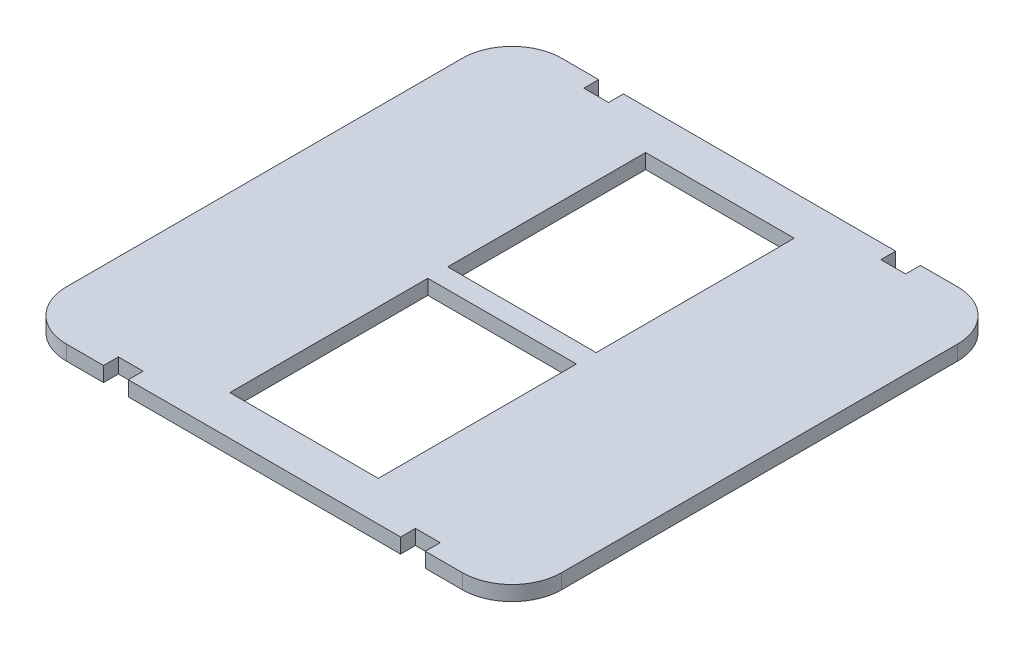
ISO-10303-21;
HEADER;
FILE_DESCRIPTION(('STEP AP214'),'2;1');
FILE_NAME('part.step','',(''),(''),'','','');
FILE_SCHEMA(('AUTOMOTIVE_DESIGN { 1 0 10303 214 1 1 1 1 }'));
ENDSEC;
DATA;
#1=APPLICATION_CONTEXT('core data for automotive mechanical design processes');
#2=APPLICATION_PROTOCOL_DEFINITION('international standard','automotive_design',2000,#1);
#3=PRODUCT_CONTEXT('',#1,'mechanical');
#4=PRODUCT('Part','Part','',(#3));
#5=PRODUCT_RELATED_PRODUCT_CATEGORY('part','',(#4));
#6=PRODUCT_DEFINITION_FORMATION('','',#4);
#7=PRODUCT_DEFINITION_CONTEXT('part definition',#1,'design');
#8=PRODUCT_DEFINITION('design','',#6,#7);
#9=PRODUCT_DEFINITION_SHAPE('','',#8);
#10=(LENGTH_UNIT() NAMED_UNIT(*) SI_UNIT(.MILLI.,.METRE.));
#11=(NAMED_UNIT(*) PLANE_ANGLE_UNIT() SI_UNIT($,.RADIAN.));
#12=(NAMED_UNIT(*) SI_UNIT($,.STERADIAN.) SOLID_ANGLE_UNIT());
#13=UNCERTAINTY_MEASURE_WITH_UNIT(LENGTH_MEASURE(1.E-05),#10,'distance_accuracy_value','');
#14=(GEOMETRIC_REPRESENTATION_CONTEXT(3) GLOBAL_UNCERTAINTY_ASSIGNED_CONTEXT((#13)) GLOBAL_UNIT_ASSIGNED_CONTEXT((#10,
#11,#12)) REPRESENTATION_CONTEXT('',''));
#15=CARTESIAN_POINT('',(0.,0.,0.));
#16=DIRECTION('',(0.,0.,1.));
#17=DIRECTION('',(1.,0.,0.));
#18=AXIS2_PLACEMENT_3D('',#15,#16,#17);
#19=CARTESIAN_POINT('',(0.,7.62,0.));
#20=DIRECTION('',(0.,-1.,0.));
#21=DIRECTION('',(0.,0.,-1.));
#22=AXIS2_PLACEMENT_3D('',#19,#20,#21);
#23=PLANE('',#22);
#24=DIRECTION('',(0.,0.,1.));
#25=VECTOR('',#24,1.);
#26=CARTESIAN_POINT('',(38.1,7.62,-5.07999999999999));
#27=LINE('',#26,#25);
#28=CARTESIAN_POINT('',(38.1,7.62,-106.68));
#29=VERTEX_POINT('',#28);
#30=CARTESIAN_POINT('',(38.1,7.62,-5.07999999999999));
#31=VERTEX_POINT('',#30);
#32=EDGE_CURVE('E471',#29,#31,#27,.T.);
#33=ORIENTED_EDGE('',*,*,#32,.T.);
#34=DIRECTION('',(-1.,0.,0.));
#35=VECTOR('',#34,1.);
#36=CARTESIAN_POINT('',(-38.1,7.62,-5.07999999999999));
#37=LINE('',#36,#35);
#38=CARTESIAN_POINT('',(-38.1,7.62,-5.07999999999999));
#39=VERTEX_POINT('',#38);
#40=EDGE_CURVE('E481',#31,#39,#37,.T.);
#41=ORIENTED_EDGE('',*,*,#40,.T.);
#42=DIRECTION('',(0.,0.,-1.));
#43=VECTOR('',#42,1.);
#44=CARTESIAN_POINT('',(-38.1,7.62,-5.07999999999999));
#45=LINE('',#44,#43);
#46=CARTESIAN_POINT('',(-38.1,7.62,-106.68));
#47=VERTEX_POINT('',#46);
#48=EDGE_CURVE('E494',#39,#47,#45,.T.);
#49=ORIENTED_EDGE('',*,*,#48,.T.);
#50=DIRECTION('',(1.,0.,0.));
#51=VECTOR('',#50,1.);
#52=CARTESIAN_POINT('',(-38.1,7.62,-106.68));
#53=LINE('',#52,#51);
#54=EDGE_CURVE('E491',#47,#29,#53,.T.);
#55=ORIENTED_EDGE('',*,*,#54,.T.);
#56=EDGE_LOOP('',(#33,#41,#49,#55));
#57=FACE_BOUND('',#56,.T.);
#58=DIRECTION('',(-1.,0.,0.));
#59=VECTOR('',#58,1.);
#60=CARTESIAN_POINT('',(-38.1,7.62,5.07999999999999));
#61=LINE('',#60,#59);
#62=CARTESIAN_POINT('',(38.1,7.62,5.07999999999999));
#63=VERTEX_POINT('',#62);
#64=CARTESIAN_POINT('',(-38.1,7.62,5.07999999999999));
#65=VERTEX_POINT('',#64);
#66=EDGE_CURVE('E367',#63,#65,#61,.T.);
#67=ORIENTED_EDGE('',*,*,#66,.F.);
#68=DIRECTION('',(0.,0.,-1.));
#69=VECTOR('',#68,1.);
#70=CARTESIAN_POINT('',(38.1,7.62,5.07999999999999));
#71=LINE('',#70,#69);
#72=CARTESIAN_POINT('',(38.1,7.62,106.68));
#73=VERTEX_POINT('',#72);
#74=EDGE_CURVE('E348',#73,#63,#71,.T.);
#75=ORIENTED_EDGE('',*,*,#74,.F.);
#76=DIRECTION('',(1.,0.,0.));
#77=VECTOR('',#76,1.);
#78=CARTESIAN_POINT('',(-38.1,7.62,106.68));
#79=LINE('',#78,#77);
#80=CARTESIAN_POINT('',(-38.1,7.62,106.68));
#81=VERTEX_POINT('',#80);
#82=EDGE_CURVE('E356',#81,#73,#79,.T.);
#83=ORIENTED_EDGE('',*,*,#82,.F.);
#84=DIRECTION('',(0.,0.,1.));
#85=VECTOR('',#84,1.);
#86=CARTESIAN_POINT('',(-38.1,7.62,5.07999999999999));
#87=LINE('',#86,#85);
#88=EDGE_CURVE('E370',#65,#81,#87,.T.);
#89=ORIENTED_EDGE('',*,*,#88,.F.);
#90=EDGE_LOOP('',(#67,#75,#83,#89));
#91=FACE_BOUND('',#90,.T.);
#92=DIRECTION('',(0.,0.,-1.));
#93=VECTOR('',#92,1.);
#94=CARTESIAN_POINT('',(69.8500000000001,7.62,119.38));
#95=LINE('',#94,#93);
#96=CARTESIAN_POINT('',(69.8500000000001,7.62,127.));
#97=VERTEX_POINT('',#96);
#98=CARTESIAN_POINT('',(69.8500000000001,7.62,119.38));
#99=VERTEX_POINT('',#98);
#100=EDGE_CURVE('E249',#97,#99,#95,.T.);
#101=ORIENTED_EDGE('',*,*,#100,.T.);
#102=DIRECTION('',(1.,0.,0.));
#103=VECTOR('',#102,1.);
#104=CARTESIAN_POINT('',(82.5500000000001,7.62,119.38));
#105=LINE('',#104,#103);
#106=CARTESIAN_POINT('',(82.5500000000001,7.62,119.38));
#107=VERTEX_POINT('',#106);
#108=EDGE_CURVE('E263',#99,#107,#105,.T.);
#109=ORIENTED_EDGE('',*,*,#108,.T.);
#110=DIRECTION('',(0.,0.,1.));
#111=VECTOR('',#110,1.);
#112=CARTESIAN_POINT('',(82.5500000000001,7.62,119.38));
#113=LINE('',#112,#111);
#114=CARTESIAN_POINT('',(82.5500000000001,7.62,127.));
#115=VERTEX_POINT('',#114);
#116=EDGE_CURVE('E436',#107,#115,#113,.T.);
#117=ORIENTED_EDGE('',*,*,#116,.T.);
#118=DIRECTION('',(1.,0.,0.));
#119=VECTOR('',#118,1.);
#120=CARTESIAN_POINT('',(-127.,7.62,127.));
#121=LINE('',#120,#119);
#122=CARTESIAN_POINT('',(101.6,7.62,127.));
#123=VERTEX_POINT('',#122);
#124=EDGE_CURVE('E394',#115,#123,#121,.T.);
#125=ORIENTED_EDGE('',*,*,#124,.T.);
#126=CARTESIAN_POINT('',(101.6,7.62,101.6));
#127=DIRECTION('',(0.,-1.,0.));
#128=DIRECTION('',(0.,0.,-1.));
#129=AXIS2_PLACEMENT_3D('',#126,#127,#128);
#130=CIRCLE('',#129,25.4);
#131=CARTESIAN_POINT('',(127.,7.62,101.6));
#132=VERTEX_POINT('',#131);
#133=EDGE_CURVE('E301',#123,#132,#130,.F.);
#134=ORIENTED_EDGE('',*,*,#133,.T.);
#135=DIRECTION('',(0.,0.,-1.));
#136=VECTOR('',#135,1.);
#137=CARTESIAN_POINT('',(127.,7.62,127.));
#138=LINE('',#137,#136);
#139=CARTESIAN_POINT('',(127.,7.62,-101.6));
#140=VERTEX_POINT('',#139);
#141=EDGE_CURVE('E272',#132,#140,#138,.T.);
#142=ORIENTED_EDGE('',*,*,#141,.T.);
#143=CARTESIAN_POINT('',(101.6,7.62,-101.6));
#144=DIRECTION('',(0.,-1.,0.));
#145=DIRECTION('',(0.,0.,-1.));
#146=AXIS2_PLACEMENT_3D('',#143,#144,#145);
#147=CIRCLE('',#146,25.4);
#148=CARTESIAN_POINT('',(101.6,7.62,-127.));
#149=VERTEX_POINT('',#148);
#150=EDGE_CURVE('E303',#140,#149,#147,.F.);
#151=ORIENTED_EDGE('',*,*,#150,.T.);
#152=DIRECTION('',(-1.,0.,0.));
#153=VECTOR('',#152,1.);
#154=CARTESIAN_POINT('',(-127.,7.62,-127.));
#155=LINE('',#154,#153);
#156=CARTESIAN_POINT('',(82.5499999999999,7.62,-127.));
#157=VERTEX_POINT('',#156);
#158=EDGE_CURVE('E387',#149,#157,#155,.T.);
#159=ORIENTED_EDGE('',*,*,#158,.T.);
#160=DIRECTION('',(0.,0.,-1.));
#161=VECTOR('',#160,1.);
#162=CARTESIAN_POINT('',(82.5499999999999,7.62,-119.38));
#163=LINE('',#162,#161);
#164=CARTESIAN_POINT('',(82.5499999999999,7.62,-119.38));
#165=VERTEX_POINT('',#164);
#166=EDGE_CURVE('E56',#165,#157,#163,.T.);
#167=ORIENTED_EDGE('',*,*,#166,.F.);
#168=DIRECTION('',(1.,0.,0.));
#169=VECTOR('',#168,1.);
#170=CARTESIAN_POINT('',(82.5499999999999,7.62,-119.38));
#171=LINE('',#170,#169);
#172=CARTESIAN_POINT('',(69.8499999999999,7.62,-119.38));
#173=VERTEX_POINT('',#172);
#174=EDGE_CURVE('E459',#173,#165,#171,.T.);
#175=ORIENTED_EDGE('',*,*,#174,.F.);
#176=DIRECTION('',(0.,0.,1.));
#177=VECTOR('',#176,1.);
#178=CARTESIAN_POINT('',(69.8499999999999,7.62,-119.38));
#179=LINE('',#178,#177);
#180=CARTESIAN_POINT('',(69.8499999999999,7.62,-127.));
#181=VERTEX_POINT('',#180);
#182=EDGE_CURVE('E465',#181,#173,#179,.T.);
#183=ORIENTED_EDGE('',*,*,#182,.F.);
#184=CARTESIAN_POINT('',(-69.85,7.62,-127.));
#185=VERTEX_POINT('',#184);
#186=EDGE_CURVE('E391',#181,#185,#155,.T.);
#187=ORIENTED_EDGE('',*,*,#186,.T.);
#188=DIRECTION('',(0.,0.,1.));
#189=VECTOR('',#188,1.);
#190=CARTESIAN_POINT('',(-69.85,7.62,-119.38));
#191=LINE('',#190,#189);
#192=CARTESIAN_POINT('',(-69.85,7.62,-119.38));
#193=VERTEX_POINT('',#192);
#194=EDGE_CURVE('E502',#185,#193,#191,.T.);
#195=ORIENTED_EDGE('',*,*,#194,.T.);
#196=DIRECTION('',(-1.,0.,0.));
#197=VECTOR('',#196,1.);
#198=CARTESIAN_POINT('',(-82.55,7.62,-119.38));
#199=LINE('',#198,#197);
#200=CARTESIAN_POINT('',(-82.55,7.62,-119.38));
#201=VERTEX_POINT('',#200);
#202=EDGE_CURVE('E512',#193,#201,#199,.T.);
#203=ORIENTED_EDGE('',*,*,#202,.T.);
#204=DIRECTION('',(0.,0.,-1.));
#205=VECTOR('',#204,1.);
#206=CARTESIAN_POINT('',(-82.55,7.62,-119.38));
#207=LINE('',#206,#205);
#208=CARTESIAN_POINT('',(-82.55,7.62,-127.));
#209=VERTEX_POINT('',#208);
#210=EDGE_CURVE('E520',#201,#209,#207,.T.);
#211=ORIENTED_EDGE('',*,*,#210,.T.);
#212=CARTESIAN_POINT('',(-101.6,7.62,-127.));
#213=VERTEX_POINT('',#212);
#214=EDGE_CURVE('E386',#209,#213,#155,.T.);
#215=ORIENTED_EDGE('',*,*,#214,.T.);
#216=CARTESIAN_POINT('',(-101.6,7.62,-101.6));
#217=DIRECTION('',(0.,-1.,0.));
#218=DIRECTION('',(0.,0.,-1.));
#219=AXIS2_PLACEMENT_3D('',#216,#217,#218);
#220=CIRCLE('',#219,25.4);
#221=CARTESIAN_POINT('',(-127.,7.62,-101.6));
#222=VERTEX_POINT('',#221);
#223=EDGE_CURVE('E305',#213,#222,#220,.F.);
#224=ORIENTED_EDGE('',*,*,#223,.T.);
#225=DIRECTION('',(0.,0.,1.));
#226=VECTOR('',#225,1.);
#227=CARTESIAN_POINT('',(-127.,7.62,127.));
#228=LINE('',#227,#226);
#229=CARTESIAN_POINT('',(-127.,7.62,101.6));
#230=VERTEX_POINT('',#229);
#231=EDGE_CURVE('E390',#222,#230,#228,.T.);
#232=ORIENTED_EDGE('',*,*,#231,.T.);
#233=CARTESIAN_POINT('',(-101.6,7.62,101.6));
#234=DIRECTION('',(0.,-1.,0.));
#235=DIRECTION('',(0.,0.,-1.));
#236=AXIS2_PLACEMENT_3D('',#233,#234,#235);
#237=CIRCLE('',#236,25.4);
#238=CARTESIAN_POINT('',(-101.6,7.62,127.));
#239=VERTEX_POINT('',#238);
#240=EDGE_CURVE('E299',#230,#239,#237,.F.);
#241=ORIENTED_EDGE('',*,*,#240,.T.);
#242=CARTESIAN_POINT('',(-82.55,7.62,127.));
#243=VERTEX_POINT('',#242);
#244=EDGE_CURVE('E280',#239,#243,#121,.T.);
#245=ORIENTED_EDGE('',*,*,#244,.T.);
#246=DIRECTION('',(0.,0.,1.));
#247=VECTOR('',#246,1.);
#248=CARTESIAN_POINT('',(-82.55,7.62,119.38));
#249=LINE('',#248,#247);
#250=CARTESIAN_POINT('',(-82.55,7.62,119.38));
#251=VERTEX_POINT('',#250);
#252=EDGE_CURVE('E345',#251,#243,#249,.T.);
#253=ORIENTED_EDGE('',*,*,#252,.F.);
#254=DIRECTION('',(-1.,0.,0.));
#255=VECTOR('',#254,1.);
#256=CARTESIAN_POINT('',(-82.55,7.62,119.38));
#257=LINE('',#256,#255);
#258=CARTESIAN_POINT('',(-69.85,7.62,119.38));
#259=VERTEX_POINT('',#258);
#260=EDGE_CURVE('E341',#259,#251,#257,.T.);
#261=ORIENTED_EDGE('',*,*,#260,.F.);
#262=DIRECTION('',(0.,0.,-1.));
#263=VECTOR('',#262,1.);
#264=CARTESIAN_POINT('',(-69.85,7.62,119.38));
#265=LINE('',#264,#263);
#266=CARTESIAN_POINT('',(-69.85,7.62,127.));
#267=VERTEX_POINT('',#266);
#268=EDGE_CURVE('E338',#267,#259,#265,.T.);
#269=ORIENTED_EDGE('',*,*,#268,.F.);
#270=EDGE_CURVE('E396',#267,#97,#121,.T.);
#271=ORIENTED_EDGE('',*,*,#270,.T.);
#272=EDGE_LOOP('',(#101,#109,#117,#125,#134,#142,#151,#159,#167,#175,#183,#187,#195,#203,#211,
#215,#224,#232,#241,#245,#253,#261,#269,#271));
#273=FACE_BOUND('',#272,.T.);
#274=ADVANCED_FACE('F33',(#57,#91,#273),#23,.F.);
#275=CARTESIAN_POINT('',(0.,0.,0.));
#276=DIRECTION('',(0.,-1.,0.));
#277=DIRECTION('',(0.,0.,-1.));
#278=AXIS2_PLACEMENT_3D('',#275,#276,#277);
#279=PLANE('',#278);
#280=DIRECTION('',(0.,0.,-1.));
#281=VECTOR('',#280,1.);
#282=CARTESIAN_POINT('',(38.1,0.,5.07999999999999));
#283=LINE('',#282,#281);
#284=CARTESIAN_POINT('',(38.1,0.,106.68));
#285=VERTEX_POINT('',#284);
#286=CARTESIAN_POINT('',(38.1,0.,5.07999999999999));
#287=VERTEX_POINT('',#286);
#288=EDGE_CURVE('E352',#285,#287,#283,.T.);
#289=ORIENTED_EDGE('',*,*,#288,.T.);
#290=DIRECTION('',(-1.,0.,0.));
#291=VECTOR('',#290,1.);
#292=CARTESIAN_POINT('',(-38.1,0.,5.07999999999999));
#293=LINE('',#292,#291);
#294=CARTESIAN_POINT('',(-38.1,0.,5.07999999999999));
#295=VERTEX_POINT('',#294);
#296=EDGE_CURVE('E355',#287,#295,#293,.T.);
#297=ORIENTED_EDGE('',*,*,#296,.T.);
#298=DIRECTION('',(0.,0.,1.));
#299=VECTOR('',#298,1.);
#300=CARTESIAN_POINT('',(-38.1,0.,5.07999999999999));
#301=LINE('',#300,#299);
#302=CARTESIAN_POINT('',(-38.1,0.,106.68));
#303=VERTEX_POINT('',#302);
#304=EDGE_CURVE('E359',#295,#303,#301,.T.);
#305=ORIENTED_EDGE('',*,*,#304,.T.);
#306=DIRECTION('',(1.,0.,0.));
#307=VECTOR('',#306,1.);
#308=CARTESIAN_POINT('',(-38.1,0.,106.68));
#309=LINE('',#308,#307);
#310=EDGE_CURVE('E362',#303,#285,#309,.T.);
#311=ORIENTED_EDGE('',*,*,#310,.T.);
#312=EDGE_LOOP('',(#289,#297,#305,#311));
#313=FACE_BOUND('',#312,.T.);
#314=DIRECTION('',(-1.,0.,0.));
#315=VECTOR('',#314,1.);
#316=CARTESIAN_POINT('',(-38.1,0.,-5.07999999999999));
#317=LINE('',#316,#315);
#318=CARTESIAN_POINT('',(38.1,0.,-5.07999999999999));
#319=VERTEX_POINT('',#318);
#320=CARTESIAN_POINT('',(-38.1,0.,-5.07999999999999));
#321=VERTEX_POINT('',#320);
#322=EDGE_CURVE('E486',#319,#321,#317,.T.);
#323=ORIENTED_EDGE('',*,*,#322,.F.);
#324=DIRECTION('',(0.,0.,1.));
#325=VECTOR('',#324,1.);
#326=CARTESIAN_POINT('',(38.1,0.,-5.07999999999999));
#327=LINE('',#326,#325);
#328=CARTESIAN_POINT('',(38.1,0.,-106.68));
#329=VERTEX_POINT('',#328);
#330=EDGE_CURVE('E478',#329,#319,#327,.T.);
#331=ORIENTED_EDGE('',*,*,#330,.F.);
#332=DIRECTION('',(1.,0.,0.));
#333=VECTOR('',#332,1.);
#334=CARTESIAN_POINT('',(-38.1,0.,-106.68));
#335=LINE('',#334,#333);
#336=CARTESIAN_POINT('',(-38.1,0.,-106.68));
#337=VERTEX_POINT('',#336);
#338=EDGE_CURVE('E480',#337,#329,#335,.T.);
#339=ORIENTED_EDGE('',*,*,#338,.F.);
#340=DIRECTION('',(0.,0.,-1.));
#341=VECTOR('',#340,1.);
#342=CARTESIAN_POINT('',(-38.1,0.,-5.07999999999999));
#343=LINE('',#342,#341);
#344=EDGE_CURVE('E483',#321,#337,#343,.T.);
#345=ORIENTED_EDGE('',*,*,#344,.F.);
#346=EDGE_LOOP('',(#323,#331,#339,#345));
#347=FACE_BOUND('',#346,.T.);
#348=DIRECTION('',(1.,0.,0.));
#349=VECTOR('',#348,1.);
#350=CARTESIAN_POINT('',(82.5500000000001,0.,119.38));
#351=LINE('',#350,#349);
#352=CARTESIAN_POINT('',(69.8500000000001,0.,119.38));
#353=VERTEX_POINT('',#352);
#354=CARTESIAN_POINT('',(82.5500000000001,0.,119.38));
#355=VERTEX_POINT('',#354);
#356=EDGE_CURVE('E255',#353,#355,#351,.T.);
#357=ORIENTED_EDGE('',*,*,#356,.F.);
#358=DIRECTION('',(0.,0.,-1.));
#359=VECTOR('',#358,1.);
#360=CARTESIAN_POINT('',(69.8500000000001,0.,119.38));
#361=LINE('',#360,#359);
#362=CARTESIAN_POINT('',(69.8500000000001,0.,127.));
#363=VERTEX_POINT('',#362);
#364=EDGE_CURVE('E246',#363,#353,#361,.T.);
#365=ORIENTED_EDGE('',*,*,#364,.F.);
#366=DIRECTION('',(1.,0.,0.));
#367=VECTOR('',#366,1.);
#368=CARTESIAN_POINT('',(-127.,0.,127.));
#369=LINE('',#368,#367);
#370=CARTESIAN_POINT('',(-69.85,0.,127.));
#371=VERTEX_POINT('',#370);
#372=EDGE_CURVE('E262',#371,#363,#369,.T.);
#373=ORIENTED_EDGE('',*,*,#372,.F.);
#374=DIRECTION('',(0.,0.,-1.));
#375=VECTOR('',#374,1.);
#376=CARTESIAN_POINT('',(-69.85,0.,119.38));
#377=LINE('',#376,#375);
#378=CARTESIAN_POINT('',(-69.85,0.,119.38));
#379=VERTEX_POINT('',#378);
#380=EDGE_CURVE('E334',#371,#379,#377,.T.);
#381=ORIENTED_EDGE('',*,*,#380,.T.);
#382=DIRECTION('',(-1.,0.,0.));
#383=VECTOR('',#382,1.);
#384=CARTESIAN_POINT('',(-82.55,0.,119.38));
#385=LINE('',#384,#383);
#386=CARTESIAN_POINT('',(-82.55,0.,119.38));
#387=VERTEX_POINT('',#386);
#388=EDGE_CURVE('E327',#379,#387,#385,.T.);
#389=ORIENTED_EDGE('',*,*,#388,.T.);
#390=DIRECTION('',(0.,0.,1.));
#391=VECTOR('',#390,1.);
#392=CARTESIAN_POINT('',(-82.55,0.,119.38));
#393=LINE('',#392,#391);
#394=CARTESIAN_POINT('',(-82.55,0.,127.));
#395=VERTEX_POINT('',#394);
#396=EDGE_CURVE('E325',#387,#395,#393,.T.);
#397=ORIENTED_EDGE('',*,*,#396,.T.);
#398=CARTESIAN_POINT('',(-101.6,0.,127.));
#399=VERTEX_POINT('',#398);
#400=EDGE_CURVE('E268',#399,#395,#369,.T.);
#401=ORIENTED_EDGE('',*,*,#400,.F.);
#402=CARTESIAN_POINT('',(-101.6,0.,101.6));
#403=DIRECTION('',(0.,-1.,0.));
#404=DIRECTION('',(0.,0.,-1.));
#405=AXIS2_PLACEMENT_3D('',#402,#403,#404);
#406=CIRCLE('',#405,25.4);
#407=CARTESIAN_POINT('',(-127.,0.,101.6));
#408=VERTEX_POINT('',#407);
#409=EDGE_CURVE('E283',#399,#408,#406,.T.);
#410=ORIENTED_EDGE('',*,*,#409,.T.);
#411=DIRECTION('',(0.,0.,1.));
#412=VECTOR('',#411,1.);
#413=CARTESIAN_POINT('',(-127.,0.,127.));
#414=LINE('',#413,#412);
#415=CARTESIAN_POINT('',(-127.,0.,-101.6));
#416=VERTEX_POINT('',#415);
#417=EDGE_CURVE('E273',#416,#408,#414,.T.);
#418=ORIENTED_EDGE('',*,*,#417,.F.);
#419=CARTESIAN_POINT('',(-101.6,0.,-101.6));
#420=DIRECTION('',(0.,-1.,0.));
#421=DIRECTION('',(0.,0.,-1.));
#422=AXIS2_PLACEMENT_3D('',#419,#420,#421);
#423=CIRCLE('',#422,25.4);
#424=CARTESIAN_POINT('',(-101.6,0.,-127.));
#425=VERTEX_POINT('',#424);
#426=EDGE_CURVE('E290',#416,#425,#423,.T.);
#427=ORIENTED_EDGE('',*,*,#426,.T.);
#428=DIRECTION('',(-1.,0.,0.));
#429=VECTOR('',#428,1.);
#430=CARTESIAN_POINT('',(-127.,0.,-127.));
#431=LINE('',#430,#429);
#432=CARTESIAN_POINT('',(-82.55,0.,-127.));
#433=VERTEX_POINT('',#432);
#434=EDGE_CURVE('E398',#433,#425,#431,.T.);
#435=ORIENTED_EDGE('',*,*,#434,.F.);
#436=DIRECTION('',(0.,0.,-1.));
#437=VECTOR('',#436,1.);
#438=CARTESIAN_POINT('',(-82.55,0.,-119.38));
#439=LINE('',#438,#437);
#440=CARTESIAN_POINT('',(-82.55,0.,-119.38));
#441=VERTEX_POINT('',#440);
#442=EDGE_CURVE('E511',#441,#433,#439,.T.);
#443=ORIENTED_EDGE('',*,*,#442,.F.);
#444=DIRECTION('',(-1.,0.,0.));
#445=VECTOR('',#444,1.);
#446=CARTESIAN_POINT('',(-82.55,0.,-119.38));
#447=LINE('',#446,#445);
#448=CARTESIAN_POINT('',(-69.85,0.,-119.38));
#449=VERTEX_POINT('',#448);
#450=EDGE_CURVE('E514',#449,#441,#447,.T.);
#451=ORIENTED_EDGE('',*,*,#450,.F.);
#452=DIRECTION('',(0.,0.,1.));
#453=VECTOR('',#452,1.);
#454=CARTESIAN_POINT('',(-69.85,0.,-119.38));
#455=LINE('',#454,#453);
#456=CARTESIAN_POINT('',(-69.85,0.,-127.));
#457=VERTEX_POINT('',#456);
#458=EDGE_CURVE('E509',#457,#449,#455,.T.);
#459=ORIENTED_EDGE('',*,*,#458,.F.);
#460=CARTESIAN_POINT('',(69.8499999999999,0.,-127.));
#461=VERTEX_POINT('',#460);
#462=EDGE_CURVE('E401',#461,#457,#431,.T.);
#463=ORIENTED_EDGE('',*,*,#462,.F.);
#464=DIRECTION('',(0.,0.,1.));
#465=VECTOR('',#464,1.);
#466=CARTESIAN_POINT('',(69.8499999999999,0.,-119.38));
#467=LINE('',#466,#465);
#468=CARTESIAN_POINT('',(69.8499999999999,0.,-119.38));
#469=VERTEX_POINT('',#468);
#470=EDGE_CURVE('E460',#461,#469,#467,.T.);
#471=ORIENTED_EDGE('',*,*,#470,.T.);
#472=DIRECTION('',(1.,0.,0.));
#473=VECTOR('',#472,1.);
#474=CARTESIAN_POINT('',(82.5499999999999,0.,-119.38));
#475=LINE('',#474,#473);
#476=CARTESIAN_POINT('',(82.5499999999999,0.,-119.38));
#477=VERTEX_POINT('',#476);
#478=EDGE_CURVE('E463',#469,#477,#475,.T.);
#479=ORIENTED_EDGE('',*,*,#478,.T.);
#480=DIRECTION('',(0.,0.,-1.));
#481=VECTOR('',#480,1.);
#482=CARTESIAN_POINT('',(82.5499999999999,0.,-119.38));
#483=LINE('',#482,#481);
#484=CARTESIAN_POINT('',(82.5499999999999,0.,-127.));
#485=VERTEX_POINT('',#484);
#486=EDGE_CURVE('E477',#477,#485,#483,.T.);
#487=ORIENTED_EDGE('',*,*,#486,.T.);
#488=CARTESIAN_POINT('',(101.6,0.,-127.));
#489=VERTEX_POINT('',#488);
#490=EDGE_CURVE('E399',#489,#485,#431,.T.);
#491=ORIENTED_EDGE('',*,*,#490,.F.);
#492=CARTESIAN_POINT('',(101.6,0.,-101.6));
#493=DIRECTION('',(0.,-1.,0.));
#494=DIRECTION('',(0.,0.,-1.));
#495=AXIS2_PLACEMENT_3D('',#492,#493,#494);
#496=CIRCLE('',#495,25.4);
#497=CARTESIAN_POINT('',(127.,0.,-101.6));
#498=VERTEX_POINT('',#497);
#499=EDGE_CURVE('E288',#489,#498,#496,.T.);
#500=ORIENTED_EDGE('',*,*,#499,.T.);
#501=DIRECTION('',(0.,0.,-1.));
#502=VECTOR('',#501,1.);
#503=CARTESIAN_POINT('',(127.,0.,127.));
#504=LINE('',#503,#502);
#505=CARTESIAN_POINT('',(127.,0.,101.6));
#506=VERTEX_POINT('',#505);
#507=EDGE_CURVE('E377',#506,#498,#504,.T.);
#508=ORIENTED_EDGE('',*,*,#507,.F.);
#509=CARTESIAN_POINT('',(101.6,0.,101.6));
#510=DIRECTION('',(0.,-1.,0.));
#511=DIRECTION('',(0.,0.,-1.));
#512=AXIS2_PLACEMENT_3D('',#509,#510,#511);
#513=CIRCLE('',#512,25.4);
#514=CARTESIAN_POINT('',(101.6,0.,127.));
#515=VERTEX_POINT('',#514);
#516=EDGE_CURVE('E285',#506,#515,#513,.T.);
#517=ORIENTED_EDGE('',*,*,#516,.T.);
#518=CARTESIAN_POINT('',(82.55,0.,127.));
#519=VERTEX_POINT('',#518);
#520=EDGE_CURVE('E269',#519,#515,#369,.T.);
#521=ORIENTED_EDGE('',*,*,#520,.F.);
#522=DIRECTION('',(0.,0.,1.));
#523=VECTOR('',#522,1.);
#524=CARTESIAN_POINT('',(82.5500000000001,0.,119.38));
#525=LINE('',#524,#523);
#526=EDGE_CURVE('E48',#355,#519,#525,.T.);
#527=ORIENTED_EDGE('',*,*,#526,.F.);
#528=EDGE_LOOP('',(#357,#365,#373,#381,#389,#397,#401,#410,#418,#427,#435,#443,#451,#459,#463,
#471,#479,#487,#491,#500,#508,#517,#521,#527));
#529=FACE_BOUND('',#528,.T.);
#530=ADVANCED_FACE('F260',(#313,#347,#529),#279,.T.);
#531=CARTESIAN_POINT('',(-127.,7.62,127.));
#532=DIRECTION('',(0.,0.,-1.));
#533=DIRECTION('',(-1.,0.,0.));
#534=AXIS2_PLACEMENT_3D('',#531,#532,#533);
#535=PLANE('',#534);
#536=DIRECTION('',(0.,1.,0.));
#537=VECTOR('',#536,1.);
#538=CARTESIAN_POINT('',(69.8500000000001,0.,127.));
#539=LINE('',#538,#537);
#540=EDGE_CURVE('E242',#363,#97,#539,.T.);
#541=ORIENTED_EDGE('',*,*,#540,.T.);
#542=ORIENTED_EDGE('',*,*,#270,.F.);
#543=DIRECTION('',(0.,1.,0.));
#544=VECTOR('',#543,1.);
#545=CARTESIAN_POINT('',(-69.85,0.,127.));
#546=LINE('',#545,#544);
#547=EDGE_CURVE('E267',#371,#267,#546,.T.);
#548=ORIENTED_EDGE('',*,*,#547,.F.);
#549=ORIENTED_EDGE('',*,*,#372,.T.);
#550=EDGE_LOOP('',(#541,#542,#548,#549));
#551=FACE_BOUND('',#550,.T.);
#552=ADVANCED_FACE('F266',(#551),#535,.F.);
#553=DIRECTION('',(0.,1.,0.));
#554=VECTOR('',#553,1.);
#555=CARTESIAN_POINT('',(82.5500000000001,0.,127.));
#556=LINE('',#555,#554);
#557=EDGE_CURVE('E254',#519,#115,#556,.T.);
#558=ORIENTED_EDGE('',*,*,#557,.F.);
#559=ORIENTED_EDGE('',*,*,#520,.T.);
#560=DIRECTION('',(0.,-1.,0.));
#561=VECTOR('',#560,1.);
#562=CARTESIAN_POINT('',(101.6,7.62,127.));
#563=LINE('',#562,#561);
#564=EDGE_CURVE('E11',#515,#123,#563,.F.);
#565=ORIENTED_EDGE('',*,*,#564,.T.);
#566=ORIENTED_EDGE('',*,*,#124,.F.);
#567=EDGE_LOOP('',(#558,#559,#565,#566));
#568=FACE_BOUND('',#567,.T.);
#569=ADVANCED_FACE('F439',(#568),#535,.F.);
#570=CARTESIAN_POINT('',(-127.,7.62,-127.));
#571=DIRECTION('',(0.,0.,1.));
#572=DIRECTION('',(1.,0.,0.));
#573=AXIS2_PLACEMENT_3D('',#570,#571,#572);
#574=PLANE('',#573);
#575=ORIENTED_EDGE('',*,*,#186,.F.);
#576=DIRECTION('',(0.,1.,0.));
#577=VECTOR('',#576,1.);
#578=CARTESIAN_POINT('',(69.8499999999999,0.,-127.));
#579=LINE('',#578,#577);
#580=EDGE_CURVE('E469',#461,#181,#579,.T.);
#581=ORIENTED_EDGE('',*,*,#580,.F.);
#582=ORIENTED_EDGE('',*,*,#462,.T.);
#583=DIRECTION('',(0.,1.,0.));
#584=VECTOR('',#583,1.);
#585=CARTESIAN_POINT('',(-69.85,0.,-127.));
#586=LINE('',#585,#584);
#587=EDGE_CURVE('E517',#457,#185,#586,.T.);
#588=ORIENTED_EDGE('',*,*,#587,.T.);
#589=EDGE_LOOP('',(#575,#581,#582,#588));
#590=FACE_BOUND('',#589,.T.);
#591=ADVANCED_FACE('F533',(#590),#574,.F.);
#592=ORIENTED_EDGE('',*,*,#490,.T.);
#593=DIRECTION('',(0.,1.,0.));
#594=VECTOR('',#593,1.);
#595=CARTESIAN_POINT('',(82.5499999999999,0.,-127.));
#596=LINE('',#595,#594);
#597=EDGE_CURVE('E455',#485,#157,#596,.T.);
#598=ORIENTED_EDGE('',*,*,#597,.T.);
#599=ORIENTED_EDGE('',*,*,#158,.F.);
#600=DIRECTION('',(0.,-1.,0.));
#601=VECTOR('',#600,1.);
#602=CARTESIAN_POINT('',(101.6,7.62,-127.));
#603=LINE('',#602,#601);
#604=EDGE_CURVE('E293',#149,#489,#603,.T.);
#605=ORIENTED_EDGE('',*,*,#604,.T.);
#606=EDGE_LOOP('',(#592,#598,#599,#605));
#607=FACE_BOUND('',#606,.T.);
#608=ADVANCED_FACE('F454',(#607),#574,.F.);
#609=DIRECTION('',(0.,1.,0.));
#610=VECTOR('',#609,1.);
#611=CARTESIAN_POINT('',(-82.55,0.,-127.));
#612=LINE('',#611,#610);
#613=EDGE_CURVE('E411',#433,#209,#612,.T.);
#614=ORIENTED_EDGE('',*,*,#613,.F.);
#615=ORIENTED_EDGE('',*,*,#434,.T.);
#616=DIRECTION('',(0.,-1.,0.));
#617=VECTOR('',#616,1.);
#618=CARTESIAN_POINT('',(-101.6,7.62,-127.));
#619=LINE('',#618,#617);
#620=EDGE_CURVE('E296',#425,#213,#619,.F.);
#621=ORIENTED_EDGE('',*,*,#620,.T.);
#622=ORIENTED_EDGE('',*,*,#214,.F.);
#623=EDGE_LOOP('',(#614,#615,#621,#622));
#624=FACE_BOUND('',#623,.T.);
#625=ADVANCED_FACE('F407',(#624),#574,.F.);
#626=CARTESIAN_POINT('',(127.,7.62,127.));
#627=DIRECTION('',(-1.,0.,0.));
#628=DIRECTION('',(0.,0.,1.));
#629=AXIS2_PLACEMENT_3D('',#626,#627,#628);
#630=PLANE('',#629);
#631=ORIENTED_EDGE('',*,*,#507,.T.);
#632=DIRECTION('',(0.,-1.,0.));
#633=VECTOR('',#632,1.);
#634=CARTESIAN_POINT('',(127.,7.62,-101.6));
#635=LINE('',#634,#633);
#636=EDGE_CURVE('E310',#498,#140,#635,.F.);
#637=ORIENTED_EDGE('',*,*,#636,.T.);
#638=ORIENTED_EDGE('',*,*,#141,.F.);
#639=DIRECTION('',(0.,-1.,0.));
#640=VECTOR('',#639,1.);
#641=CARTESIAN_POINT('',(127.,7.62,101.6));
#642=LINE('',#641,#640);
#643=EDGE_CURVE('E307',#132,#506,#642,.T.);
#644=ORIENTED_EDGE('',*,*,#643,.T.);
#645=EDGE_LOOP('',(#631,#637,#638,#644));
#646=FACE_BOUND('',#645,.T.);
#647=ADVANCED_FACE('F446',(#646),#630,.F.);
#648=CARTESIAN_POINT('',(-127.,7.62,127.));
#649=DIRECTION('',(1.,0.,0.));
#650=DIRECTION('',(0.,0.,-1.));
#651=AXIS2_PLACEMENT_3D('',#648,#649,#650);
#652=PLANE('',#651);
#653=ORIENTED_EDGE('',*,*,#231,.F.);
#654=DIRECTION('',(0.,-1.,0.));
#655=VECTOR('',#654,1.);
#656=CARTESIAN_POINT('',(-127.,7.62,-101.6));
#657=LINE('',#656,#655);
#658=EDGE_CURVE('E279',#222,#416,#657,.T.);
#659=ORIENTED_EDGE('',*,*,#658,.T.);
#660=ORIENTED_EDGE('',*,*,#417,.T.);
#661=DIRECTION('',(0.,-1.,0.));
#662=VECTOR('',#661,1.);
#663=CARTESIAN_POINT('',(-127.,7.62,101.6));
#664=LINE('',#663,#662);
#665=EDGE_CURVE('E277',#408,#230,#664,.F.);
#666=ORIENTED_EDGE('',*,*,#665,.T.);
#667=EDGE_LOOP('',(#653,#659,#660,#666));
#668=FACE_BOUND('',#667,.T.);
#669=ADVANCED_FACE('F420',(#668),#652,.F.);
#670=ORIENTED_EDGE('',*,*,#400,.T.);
#671=DIRECTION('',(0.,1.,0.));
#672=VECTOR('',#671,1.);
#673=CARTESIAN_POINT('',(-82.55,0.,127.));
#674=LINE('',#673,#672);
#675=EDGE_CURVE('E349',#395,#243,#674,.T.);
#676=ORIENTED_EDGE('',*,*,#675,.T.);
#677=ORIENTED_EDGE('',*,*,#244,.F.);
#678=DIRECTION('',(0.,-1.,0.));
#679=VECTOR('',#678,1.);
#680=CARTESIAN_POINT('',(-101.6,7.62,127.));
#681=LINE('',#680,#679);
#682=EDGE_CURVE('E41',#239,#399,#681,.T.);
#683=ORIENTED_EDGE('',*,*,#682,.T.);
#684=EDGE_LOOP('',(#670,#676,#677,#683));
#685=FACE_BOUND('',#684,.T.);
#686=ADVANCED_FACE('F316',(#685),#535,.F.);
#687=CARTESIAN_POINT('',(38.1,0.,5.07999999999999));
#688=DIRECTION('',(1.,0.,0.));
#689=DIRECTION('',(0.,0.,-1.));
#690=AXIS2_PLACEMENT_3D('',#687,#688,#689);
#691=PLANE('',#690);
#692=ORIENTED_EDGE('',*,*,#74,.T.);
#693=DIRECTION('',(0.,1.,0.));
#694=VECTOR('',#693,1.);
#695=CARTESIAN_POINT('',(38.1,0.,5.07999999999999));
#696=LINE('',#695,#694);
#697=EDGE_CURVE('E365',#287,#63,#696,.T.);
#698=ORIENTED_EDGE('',*,*,#697,.F.);
#699=ORIENTED_EDGE('',*,*,#288,.F.);
#700=DIRECTION('',(0.,1.,0.));
#701=VECTOR('',#700,1.);
#702=CARTESIAN_POINT('',(38.1,0.,106.68));
#703=LINE('',#702,#701);
#704=EDGE_CURVE('E375',#285,#73,#703,.T.);
#705=ORIENTED_EDGE('',*,*,#704,.T.);
#706=EDGE_LOOP('',(#692,#698,#699,#705));
#707=FACE_BOUND('',#706,.T.);
#708=ADVANCED_FACE('F580',(#707),#691,.F.);
#709=CARTESIAN_POINT('',(-38.1,0.,106.68));
#710=DIRECTION('',(0.,0.,1.));
#711=DIRECTION('',(1.,0.,0.));
#712=AXIS2_PLACEMENT_3D('',#709,#710,#711);
#713=PLANE('',#712);
#714=ORIENTED_EDGE('',*,*,#82,.T.);
#715=ORIENTED_EDGE('',*,*,#704,.F.);
#716=ORIENTED_EDGE('',*,*,#310,.F.);
#717=DIRECTION('',(0.,1.,0.));
#718=VECTOR('',#717,1.);
#719=CARTESIAN_POINT('',(-38.1,0.,106.68));
#720=LINE('',#719,#718);
#721=EDGE_CURVE('E378',#303,#81,#720,.T.);
#722=ORIENTED_EDGE('',*,*,#721,.T.);
#723=EDGE_LOOP('',(#714,#715,#716,#722));
#724=FACE_BOUND('',#723,.T.);
#725=ADVANCED_FACE('F609',(#724),#713,.F.);
#726=CARTESIAN_POINT('',(-38.1,0.,5.07999999999999));
#727=DIRECTION('',(-1.,0.,0.));
#728=DIRECTION('',(0.,0.,1.));
#729=AXIS2_PLACEMENT_3D('',#726,#727,#728);
#730=PLANE('',#729);
#731=ORIENTED_EDGE('',*,*,#88,.T.);
#732=ORIENTED_EDGE('',*,*,#721,.F.);
#733=ORIENTED_EDGE('',*,*,#304,.F.);
#734=DIRECTION('',(0.,1.,0.));
#735=VECTOR('',#734,1.);
#736=CARTESIAN_POINT('',(-38.1,0.,5.07999999999999));
#737=LINE('',#736,#735);
#738=EDGE_CURVE('E380',#295,#65,#737,.T.);
#739=ORIENTED_EDGE('',*,*,#738,.T.);
#740=EDGE_LOOP('',(#731,#732,#733,#739));
#741=FACE_BOUND('',#740,.T.);
#742=ADVANCED_FACE('F612',(#741),#730,.F.);
#743=CARTESIAN_POINT('',(-38.1,0.,5.07999999999999));
#744=DIRECTION('',(0.,0.,-1.));
#745=DIRECTION('',(-1.,0.,0.));
#746=AXIS2_PLACEMENT_3D('',#743,#744,#745);
#747=PLANE('',#746);
#748=ORIENTED_EDGE('',*,*,#66,.T.);
#749=ORIENTED_EDGE('',*,*,#738,.F.);
#750=ORIENTED_EDGE('',*,*,#296,.F.);
#751=ORIENTED_EDGE('',*,*,#697,.T.);
#752=EDGE_LOOP('',(#748,#749,#750,#751));
#753=FACE_BOUND('',#752,.T.);
#754=ADVANCED_FACE('F593',(#753),#747,.F.);
#755=CARTESIAN_POINT('',(-101.6,7.62,-101.6));
#756=DIRECTION('',(0.,-1.,0.));
#757=DIRECTION('',(0.,0.,-1.));
#758=AXIS2_PLACEMENT_3D('',#755,#756,#757);
#759=CYLINDRICAL_SURFACE('',#758,25.4);
#760=ORIENTED_EDGE('',*,*,#223,.F.);
#761=ORIENTED_EDGE('',*,*,#620,.F.);
#762=ORIENTED_EDGE('',*,*,#426,.F.);
#763=ORIENTED_EDGE('',*,*,#658,.F.);
#764=EDGE_LOOP('',(#760,#761,#762,#763));
#765=FACE_BOUND('',#764,.T.);
#766=ADVANCED_FACE('F415',(#765),#759,.T.);
#767=CARTESIAN_POINT('',(101.6,7.62,-101.6));
#768=DIRECTION('',(0.,-1.,0.));
#769=DIRECTION('',(0.,0.,-1.));
#770=AXIS2_PLACEMENT_3D('',#767,#768,#769);
#771=CYLINDRICAL_SURFACE('',#770,25.4);
#772=ORIENTED_EDGE('',*,*,#150,.F.);
#773=ORIENTED_EDGE('',*,*,#636,.F.);
#774=ORIENTED_EDGE('',*,*,#499,.F.);
#775=ORIENTED_EDGE('',*,*,#604,.F.);
#776=EDGE_LOOP('',(#772,#773,#774,#775));
#777=FACE_BOUND('',#776,.T.);
#778=ADVANCED_FACE('F452',(#777),#771,.T.);
#779=CARTESIAN_POINT('',(101.6,7.62,101.6));
#780=DIRECTION('',(0.,-1.,0.));
#781=DIRECTION('',(0.,0.,-1.));
#782=AXIS2_PLACEMENT_3D('',#779,#780,#781);
#783=CYLINDRICAL_SURFACE('',#782,25.4);
#784=ORIENTED_EDGE('',*,*,#133,.F.);
#785=ORIENTED_EDGE('',*,*,#564,.F.);
#786=ORIENTED_EDGE('',*,*,#516,.F.);
#787=ORIENTED_EDGE('',*,*,#643,.F.);
#788=EDGE_LOOP('',(#784,#785,#786,#787));
#789=FACE_BOUND('',#788,.T.);
#790=ADVANCED_FACE('F443',(#789),#783,.T.);
#791=CARTESIAN_POINT('',(-101.6,7.62,101.6));
#792=DIRECTION('',(0.,-1.,0.));
#793=DIRECTION('',(0.,0.,-1.));
#794=AXIS2_PLACEMENT_3D('',#791,#792,#793);
#795=CYLINDRICAL_SURFACE('',#794,25.4);
#796=ORIENTED_EDGE('',*,*,#240,.F.);
#797=ORIENTED_EDGE('',*,*,#665,.F.);
#798=ORIENTED_EDGE('',*,*,#409,.F.);
#799=ORIENTED_EDGE('',*,*,#682,.F.);
#800=EDGE_LOOP('',(#796,#797,#798,#799));
#801=FACE_BOUND('',#800,.T.);
#802=ADVANCED_FACE('F35',(#801),#795,.T.);
#803=CARTESIAN_POINT('',(-69.85,0.,119.38));
#804=DIRECTION('',(1.,0.,0.));
#805=DIRECTION('',(0.,0.,-1.));
#806=AXIS2_PLACEMENT_3D('',#803,#804,#805);
#807=PLANE('',#806);
#808=ORIENTED_EDGE('',*,*,#268,.T.);
#809=DIRECTION('',(0.,1.,0.));
#810=VECTOR('',#809,1.);
#811=CARTESIAN_POINT('',(-69.85,0.,119.38));
#812=LINE('',#811,#810);
#813=EDGE_CURVE('E330',#379,#259,#812,.T.);
#814=ORIENTED_EDGE('',*,*,#813,.F.);
#815=ORIENTED_EDGE('',*,*,#380,.F.);
#816=ORIENTED_EDGE('',*,*,#547,.T.);
#817=EDGE_LOOP('',(#808,#814,#815,#816));
#818=FACE_BOUND('',#817,.T.);
#819=ADVANCED_FACE('F429',(#818),#807,.F.);
#820=CARTESIAN_POINT('',(-82.55,0.,119.38));
#821=DIRECTION('',(-1.,0.,0.));
#822=DIRECTION('',(0.,0.,1.));
#823=AXIS2_PLACEMENT_3D('',#820,#821,#822);
#824=PLANE('',#823);
#825=ORIENTED_EDGE('',*,*,#252,.T.);
#826=ORIENTED_EDGE('',*,*,#675,.F.);
#827=ORIENTED_EDGE('',*,*,#396,.F.);
#828=DIRECTION('',(0.,1.,0.));
#829=VECTOR('',#828,1.);
#830=CARTESIAN_POINT('',(-82.55,0.,119.38));
#831=LINE('',#830,#829);
#832=EDGE_CURVE('E332',#387,#251,#831,.T.);
#833=ORIENTED_EDGE('',*,*,#832,.T.);
#834=EDGE_LOOP('',(#825,#826,#827,#833));
#835=FACE_BOUND('',#834,.T.);
#836=ADVANCED_FACE('F425',(#835),#824,.F.);
#837=CARTESIAN_POINT('',(-82.55,0.,119.38));
#838=DIRECTION('',(0.,0.,-1.));
#839=DIRECTION('',(-1.,0.,0.));
#840=AXIS2_PLACEMENT_3D('',#837,#838,#839);
#841=PLANE('',#840);
#842=ORIENTED_EDGE('',*,*,#260,.T.);
#843=ORIENTED_EDGE('',*,*,#832,.F.);
#844=ORIENTED_EDGE('',*,*,#388,.F.);
#845=ORIENTED_EDGE('',*,*,#813,.T.);
#846=EDGE_LOOP('',(#842,#843,#844,#845));
#847=FACE_BOUND('',#846,.T.);
#848=ADVANCED_FACE('F427',(#847),#841,.F.);
#849=CARTESIAN_POINT('',(-69.85,0.,-119.38));
#850=DIRECTION('',(-1.,0.,0.));
#851=DIRECTION('',(0.,0.,1.));
#852=AXIS2_PLACEMENT_3D('',#849,#850,#851);
#853=PLANE('',#852);
#854=ORIENTED_EDGE('',*,*,#194,.F.);
#855=ORIENTED_EDGE('',*,*,#587,.F.);
#856=ORIENTED_EDGE('',*,*,#458,.T.);
#857=DIRECTION('',(0.,1.,0.));
#858=VECTOR('',#857,1.);
#859=CARTESIAN_POINT('',(-69.85,0.,-119.38));
#860=LINE('',#859,#858);
#861=EDGE_CURVE('E342',#449,#193,#860,.T.);
#862=ORIENTED_EDGE('',*,*,#861,.T.);
#863=EDGE_LOOP('',(#854,#855,#856,#862));
#864=FACE_BOUND('',#863,.T.);
#865=ADVANCED_FACE('F539',(#864),#853,.T.);
#866=CARTESIAN_POINT('',(-82.55,0.,-119.38));
#867=DIRECTION('',(0.,0.,-1.));
#868=DIRECTION('',(-1.,0.,0.));
#869=AXIS2_PLACEMENT_3D('',#866,#867,#868);
#870=PLANE('',#869);
#871=ORIENTED_EDGE('',*,*,#202,.F.);
#872=ORIENTED_EDGE('',*,*,#861,.F.);
#873=ORIENTED_EDGE('',*,*,#450,.T.);
#874=DIRECTION('',(0.,1.,0.));
#875=VECTOR('',#874,1.);
#876=CARTESIAN_POINT('',(-82.55,0.,-119.38));
#877=LINE('',#876,#875);
#878=EDGE_CURVE('E526',#441,#201,#877,.T.);
#879=ORIENTED_EDGE('',*,*,#878,.T.);
#880=EDGE_LOOP('',(#871,#872,#873,#879));
#881=FACE_BOUND('',#880,.T.);
#882=ADVANCED_FACE('F543',(#881),#870,.T.);
#883=CARTESIAN_POINT('',(-82.55,0.,-119.38));
#884=DIRECTION('',(1.,0.,0.));
#885=DIRECTION('',(0.,0.,-1.));
#886=AXIS2_PLACEMENT_3D('',#883,#884,#885);
#887=PLANE('',#886);
#888=ORIENTED_EDGE('',*,*,#210,.F.);
#889=ORIENTED_EDGE('',*,*,#878,.F.);
#890=ORIENTED_EDGE('',*,*,#442,.T.);
#891=ORIENTED_EDGE('',*,*,#613,.T.);
#892=EDGE_LOOP('',(#888,#889,#890,#891));
#893=FACE_BOUND('',#892,.T.);
#894=ADVANCED_FACE('F725',(#893),#887,.T.);
#895=CARTESIAN_POINT('',(38.1,0.,-5.07999999999999));
#896=DIRECTION('',(-1.,0.,0.));
#897=DIRECTION('',(0.,0.,1.));
#898=AXIS2_PLACEMENT_3D('',#895,#896,#897);
#899=PLANE('',#898);
#900=ORIENTED_EDGE('',*,*,#32,.F.);
#901=DIRECTION('',(0.,1.,0.));
#902=VECTOR('',#901,1.);
#903=CARTESIAN_POINT('',(38.1,0.,-106.68));
#904=LINE('',#903,#902);
#905=EDGE_CURVE('E488',#329,#29,#904,.T.);
#906=ORIENTED_EDGE('',*,*,#905,.F.);
#907=ORIENTED_EDGE('',*,*,#330,.T.);
#908=DIRECTION('',(0.,1.,0.));
#909=VECTOR('',#908,1.);
#910=CARTESIAN_POINT('',(38.1,0.,-5.07999999999999));
#911=LINE('',#910,#909);
#912=EDGE_CURVE('E499',#319,#31,#911,.T.);
#913=ORIENTED_EDGE('',*,*,#912,.T.);
#914=EDGE_LOOP('',(#900,#906,#907,#913));
#915=FACE_BOUND('',#914,.T.);
#916=ADVANCED_FACE('F734',(#915),#899,.T.);
#917=CARTESIAN_POINT('',(-38.1,0.,-5.07999999999999));
#918=DIRECTION('',(0.,0.,-1.));
#919=DIRECTION('',(-1.,0.,0.));
#920=AXIS2_PLACEMENT_3D('',#917,#918,#919);
#921=PLANE('',#920);
#922=ORIENTED_EDGE('',*,*,#40,.F.);
#923=ORIENTED_EDGE('',*,*,#912,.F.);
#924=ORIENTED_EDGE('',*,*,#322,.T.);
#925=DIRECTION('',(0.,1.,0.));
#926=VECTOR('',#925,1.);
#927=CARTESIAN_POINT('',(-38.1,0.,-5.07999999999999));
#928=LINE('',#927,#926);
#929=EDGE_CURVE('E503',#321,#39,#928,.T.);
#930=ORIENTED_EDGE('',*,*,#929,.T.);
#931=EDGE_LOOP('',(#922,#923,#924,#930));
#932=FACE_BOUND('',#931,.T.);
#933=ADVANCED_FACE('F744',(#932),#921,.T.);
#934=CARTESIAN_POINT('',(-38.1,0.,-5.07999999999999));
#935=DIRECTION('',(1.,0.,0.));
#936=DIRECTION('',(0.,0.,-1.));
#937=AXIS2_PLACEMENT_3D('',#934,#935,#936);
#938=PLANE('',#937);
#939=ORIENTED_EDGE('',*,*,#48,.F.);
#940=ORIENTED_EDGE('',*,*,#929,.F.);
#941=ORIENTED_EDGE('',*,*,#344,.T.);
#942=DIRECTION('',(0.,1.,0.));
#943=VECTOR('',#942,1.);
#944=CARTESIAN_POINT('',(-38.1,0.,-106.68));
#945=LINE('',#944,#943);
#946=EDGE_CURVE('E505',#337,#47,#945,.T.);
#947=ORIENTED_EDGE('',*,*,#946,.T.);
#948=EDGE_LOOP('',(#939,#940,#941,#947));
#949=FACE_BOUND('',#948,.T.);
#950=ADVANCED_FACE('F754',(#949),#938,.T.);
#951=CARTESIAN_POINT('',(-38.1,0.,-106.68));
#952=DIRECTION('',(0.,0.,1.));
#953=DIRECTION('',(1.,0.,0.));
#954=AXIS2_PLACEMENT_3D('',#951,#952,#953);
#955=PLANE('',#954);
#956=ORIENTED_EDGE('',*,*,#54,.F.);
#957=ORIENTED_EDGE('',*,*,#946,.F.);
#958=ORIENTED_EDGE('',*,*,#338,.T.);
#959=ORIENTED_EDGE('',*,*,#905,.T.);
#960=EDGE_LOOP('',(#956,#957,#958,#959));
#961=FACE_BOUND('',#960,.T.);
#962=ADVANCED_FACE('F764',(#961),#955,.T.);
#963=CARTESIAN_POINT('',(69.8499999999999,0.,-119.38));
#964=DIRECTION('',(-1.,0.,0.));
#965=DIRECTION('',(0.,0.,1.));
#966=AXIS2_PLACEMENT_3D('',#963,#964,#965);
#967=PLANE('',#966);
#968=ORIENTED_EDGE('',*,*,#182,.T.);
#969=DIRECTION('',(0.,1.,0.));
#970=VECTOR('',#969,1.);
#971=CARTESIAN_POINT('',(69.8499999999999,0.,-119.38));
#972=LINE('',#971,#970);
#973=EDGE_CURVE('E475',#469,#173,#972,.T.);
#974=ORIENTED_EDGE('',*,*,#973,.F.);
#975=ORIENTED_EDGE('',*,*,#470,.F.);
#976=ORIENTED_EDGE('',*,*,#580,.T.);
#977=EDGE_LOOP('',(#968,#974,#975,#976));
#978=FACE_BOUND('',#977,.T.);
#979=ADVANCED_FACE('F773',(#978),#967,.F.);
#980=CARTESIAN_POINT('',(82.5499999999999,0.,-119.38));
#981=DIRECTION('',(1.,0.,0.));
#982=DIRECTION('',(0.,0.,-1.));
#983=AXIS2_PLACEMENT_3D('',#980,#981,#982);
#984=PLANE('',#983);
#985=ORIENTED_EDGE('',*,*,#166,.T.);
#986=ORIENTED_EDGE('',*,*,#597,.F.);
#987=ORIENTED_EDGE('',*,*,#486,.F.);
#988=DIRECTION('',(0.,1.,0.));
#989=VECTOR('',#988,1.);
#990=CARTESIAN_POINT('',(82.5499999999999,0.,-119.38));
#991=LINE('',#990,#989);
#992=EDGE_CURVE('E473',#477,#165,#991,.T.);
#993=ORIENTED_EDGE('',*,*,#992,.T.);
#994=EDGE_LOOP('',(#985,#986,#987,#993));
#995=FACE_BOUND('',#994,.T.);
#996=ADVANCED_FACE('F820',(#995),#984,.F.);
#997=CARTESIAN_POINT('',(82.5499999999999,0.,-119.38));
#998=DIRECTION('',(0.,0.,1.));
#999=DIRECTION('',(1.,0.,0.));
#1000=AXIS2_PLACEMENT_3D('',#997,#998,#999);
#1001=PLANE('',#1000);
#1002=ORIENTED_EDGE('',*,*,#174,.T.);
#1003=ORIENTED_EDGE('',*,*,#992,.F.);
#1004=ORIENTED_EDGE('',*,*,#478,.F.);
#1005=ORIENTED_EDGE('',*,*,#973,.T.);
#1006=EDGE_LOOP('',(#1002,#1003,#1004,#1005));
#1007=FACE_BOUND('',#1006,.T.);
#1008=ADVANCED_FACE('F829',(#1007),#1001,.F.);
#1009=CARTESIAN_POINT('',(69.8500000000001,0.,119.38));
#1010=DIRECTION('',(1.,0.,0.));
#1011=DIRECTION('',(0.,0.,-1.));
#1012=AXIS2_PLACEMENT_3D('',#1009,#1010,#1011);
#1013=PLANE('',#1012);
#1014=ORIENTED_EDGE('',*,*,#100,.F.);
#1015=ORIENTED_EDGE('',*,*,#540,.F.);
#1016=ORIENTED_EDGE('',*,*,#364,.T.);
#1017=DIRECTION('',(0.,1.,0.));
#1018=VECTOR('',#1017,1.);
#1019=CARTESIAN_POINT('',(69.8500000000001,0.,119.38));
#1020=LINE('',#1019,#1018);
#1021=EDGE_CURVE('E547',#353,#99,#1020,.T.);
#1022=ORIENTED_EDGE('',*,*,#1021,.T.);
#1023=EDGE_LOOP('',(#1014,#1015,#1016,#1022));
#1024=FACE_BOUND('',#1023,.T.);
#1025=ADVANCED_FACE('F244',(#1024),#1013,.T.);
#1026=CARTESIAN_POINT('',(82.5500000000001,0.,119.38));
#1027=DIRECTION('',(0.,0.,1.));
#1028=DIRECTION('',(1.,0.,0.));
#1029=AXIS2_PLACEMENT_3D('',#1026,#1027,#1028);
#1030=PLANE('',#1029);
#1031=ORIENTED_EDGE('',*,*,#108,.F.);
#1032=ORIENTED_EDGE('',*,*,#1021,.F.);
#1033=ORIENTED_EDGE('',*,*,#356,.T.);
#1034=DIRECTION('',(0.,1.,0.));
#1035=VECTOR('',#1034,1.);
#1036=CARTESIAN_POINT('',(82.5500000000001,0.,119.38));
#1037=LINE('',#1036,#1035);
#1038=EDGE_CURVE('E548',#355,#107,#1037,.T.);
#1039=ORIENTED_EDGE('',*,*,#1038,.T.);
#1040=EDGE_LOOP('',(#1031,#1032,#1033,#1039));
#1041=FACE_BOUND('',#1040,.T.);
#1042=ADVANCED_FACE('F561',(#1041),#1030,.T.);
#1043=CARTESIAN_POINT('',(82.5500000000001,0.,119.38));
#1044=DIRECTION('',(-1.,0.,0.));
#1045=DIRECTION('',(0.,0.,1.));
#1046=AXIS2_PLACEMENT_3D('',#1043,#1044,#1045);
#1047=PLANE('',#1046);
#1048=ORIENTED_EDGE('',*,*,#116,.F.);
#1049=ORIENTED_EDGE('',*,*,#1038,.F.);
#1050=ORIENTED_EDGE('',*,*,#526,.T.);
#1051=ORIENTED_EDGE('',*,*,#557,.T.);
#1052=EDGE_LOOP('',(#1048,#1049,#1050,#1051));
#1053=FACE_BOUND('',#1052,.T.);
#1054=ADVANCED_FACE('F562',(#1053),#1047,.T.);
#1055=CLOSED_SHELL('',(#274,#530,#552,#569,#591,#608,#625,#647,#669,#686,#708,#725,#742,#754,
#766,#778,#790,#802,#819,#836,#848,#865,#882,#894,#916,#933,#950,#962,#979,#996,#1008,#1025,
#1042,#1054));
#1056=MANIFOLD_SOLID_BREP('B2',#1055);
#1057=ADVANCED_BREP_SHAPE_REPRESENTATION('',(#18,#1056),#14);
#1058=SHAPE_DEFINITION_REPRESENTATION(#9,#1057);
ENDSEC;
END-ISO-10303-21;
